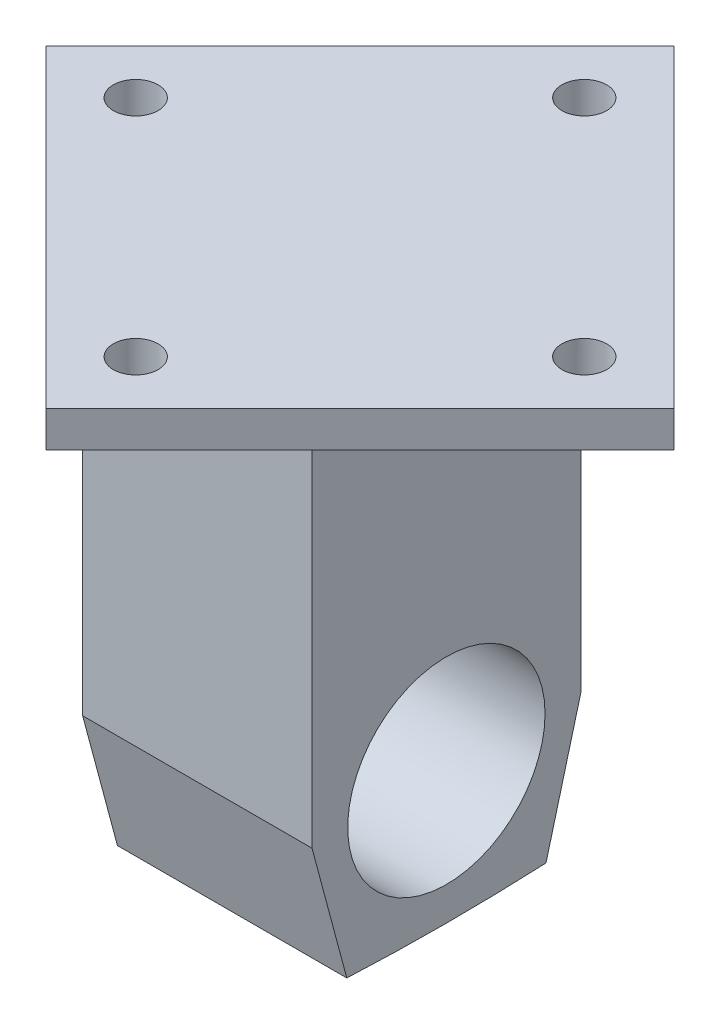
ISO-10303-21;
HEADER;
FILE_DESCRIPTION(('STEP AP214'),'2;1');
FILE_NAME('part.step','',(''),(''),'','','');
FILE_SCHEMA(('AUTOMOTIVE_DESIGN { 1 0 10303 214 1 1 1 1 }'));
ENDSEC;
DATA;
#1=APPLICATION_CONTEXT('core data for automotive mechanical design processes');
#2=APPLICATION_PROTOCOL_DEFINITION('international standard','automotive_design',2000,#1);
#3=PRODUCT_CONTEXT('',#1,'mechanical');
#4=PRODUCT('Part','Part','',(#3));
#5=PRODUCT_RELATED_PRODUCT_CATEGORY('part','',(#4));
#6=PRODUCT_DEFINITION_FORMATION('','',#4);
#7=PRODUCT_DEFINITION_CONTEXT('part definition',#1,'design');
#8=PRODUCT_DEFINITION('design','',#6,#7);
#9=PRODUCT_DEFINITION_SHAPE('','',#8);
#10=(LENGTH_UNIT() NAMED_UNIT(*) SI_UNIT(.MILLI.,.METRE.));
#11=(NAMED_UNIT(*) PLANE_ANGLE_UNIT() SI_UNIT($,.RADIAN.));
#12=(NAMED_UNIT(*) SI_UNIT($,.STERADIAN.) SOLID_ANGLE_UNIT());
#13=UNCERTAINTY_MEASURE_WITH_UNIT(LENGTH_MEASURE(1.E-05),#10,'distance_accuracy_value','');
#14=(GEOMETRIC_REPRESENTATION_CONTEXT(3) GLOBAL_UNCERTAINTY_ASSIGNED_CONTEXT((#13)) GLOBAL_UNIT_ASSIGNED_CONTEXT((#10,
#11,#12)) REPRESENTATION_CONTEXT('',''));
#15=CARTESIAN_POINT('',(0.,0.,0.));
#16=DIRECTION('',(0.,0.,1.));
#17=DIRECTION('',(1.,0.,0.));
#18=AXIS2_PLACEMENT_3D('',#15,#16,#17);
#19=CARTESIAN_POINT('',(16.256,50.292,19.05));
#20=DIRECTION('',(-1.,0.,0.));
#21=DIRECTION('',(0.,0.,1.));
#22=AXIS2_PLACEMENT_3D('',#19,#20,#21);
#23=PLANE('',#22);
#24=CARTESIAN_POINT('',(16.256,0.,0.));
#25=DIRECTION('',(1.,0.,0.));
#26=DIRECTION('',(0.,0.,-1.));
#27=AXIS2_PLACEMENT_3D('',#24,#25,#26);
#28=CIRCLE('',#27,13.9871704);
#29=CARTESIAN_POINT('',(16.256,0.,-13.9871704));
#30=VERTEX_POINT('',#29);
#31=EDGE_CURVE('E133',#30,#30,#28,.T.);
#32=ORIENTED_EDGE('',*,*,#31,.F.);
#33=EDGE_LOOP('',(#32));
#34=FACE_BOUND('',#33,.T.);
#35=DIRECTION('',(0.,-1.,0.));
#36=VECTOR('',#35,1.);
#37=CARTESIAN_POINT('',(16.256,50.292,19.05));
#38=LINE('',#37,#36);
#39=CARTESIAN_POINT('',(16.256,50.292,19.05));
#40=VERTEX_POINT('',#39);
#41=CARTESIAN_POINT('',(16.256,0.,19.05));
#42=VERTEX_POINT('',#41);
#43=EDGE_CURVE('E176',#40,#42,#38,.T.);
#44=ORIENTED_EDGE('',*,*,#43,.T.);
#45=DIRECTION('',(0.,-0.965925826289069,-0.258819045102518));
#46=VECTOR('',#45,1.);
#47=CARTESIAN_POINT('',(16.256,0.,19.05));
#48=LINE('',#47,#46);
#49=CARTESIAN_POINT('',(16.256,-18.4008869908068,14.119497190797));
#50=VERTEX_POINT('',#49);
#51=EDGE_CURVE('E145',#42,#50,#48,.T.);
#52=ORIENTED_EDGE('',*,*,#51,.T.);
#53=CARTESIAN_POINT('',(16.256,281.254621695724,4.34076685363883E-13));
#54=DIRECTION('',(-1.,0.,0.));
#55=DIRECTION('',(0.,0.,1.));
#56=AXIS2_PLACEMENT_3D('',#53,#54,#55);
#57=CIRCLE('',#56,299.987973237435);
#58=CARTESIAN_POINT('',(16.256,-18.4008869908067,-14.119497190797));
#59=VERTEX_POINT('',#58);
#60=EDGE_CURVE('E153',#59,#50,#57,.T.);
#61=ORIENTED_EDGE('',*,*,#60,.F.);
#62=DIRECTION('',(0.,-0.965925826289067,0.258819045102525));
#63=VECTOR('',#62,1.);
#64=CARTESIAN_POINT('',(16.256,0.,-19.05));
#65=LINE('',#64,#63);
#66=CARTESIAN_POINT('',(16.256,0.,-19.05));
#67=VERTEX_POINT('',#66);
#68=EDGE_CURVE('E151',#67,#59,#65,.T.);
#69=ORIENTED_EDGE('',*,*,#68,.F.);
#70=DIRECTION('',(0.,-1.,0.));
#71=VECTOR('',#70,1.);
#72=CARTESIAN_POINT('',(16.256,50.292,-19.05));
#73=LINE('',#72,#71);
#74=CARTESIAN_POINT('',(16.256,50.292,-19.05));
#75=VERTEX_POINT('',#74);
#76=EDGE_CURVE('E11',#75,#67,#73,.T.);
#77=ORIENTED_EDGE('',*,*,#76,.F.);
#78=DIRECTION('',(0.,0.,-1.));
#79=VECTOR('',#78,1.);
#80=CARTESIAN_POINT('',(16.256,50.292,19.05));
#81=LINE('',#80,#79);
#82=EDGE_CURVE('E163',#40,#75,#81,.T.);
#83=ORIENTED_EDGE('',*,*,#82,.F.);
#84=EDGE_LOOP('',(#44,#52,#61,#69,#77,#83));
#85=FACE_BOUND('',#84,.T.);
#86=ADVANCED_FACE('F33',(#34,#85),#23,.F.);
#87=CARTESIAN_POINT('',(-16.256,50.292,-19.05));
#88=DIRECTION('',(0.,0.,1.));
#89=DIRECTION('',(1.,0.,0.));
#90=AXIS2_PLACEMENT_3D('',#87,#88,#89);
#91=PLANE('',#90);
#92=DIRECTION('',(-1.,0.,0.));
#93=VECTOR('',#92,1.);
#94=CARTESIAN_POINT('',(-16.256,0.,-19.05));
#95=LINE('',#94,#93);
#96=CARTESIAN_POINT('',(-16.256,0.,-19.05));
#97=VERTEX_POINT('',#96);
#98=EDGE_CURVE('E162',#67,#97,#95,.T.);
#99=ORIENTED_EDGE('',*,*,#98,.T.);
#100=DIRECTION('',(0.,-1.,0.));
#101=VECTOR('',#100,1.);
#102=CARTESIAN_POINT('',(-16.256,50.292,-19.05));
#103=LINE('',#102,#101);
#104=CARTESIAN_POINT('',(-16.256,50.292,-19.05));
#105=VERTEX_POINT('',#104);
#106=EDGE_CURVE('E42',#105,#97,#103,.T.);
#107=ORIENTED_EDGE('',*,*,#106,.F.);
#108=DIRECTION('',(-1.,0.,0.));
#109=VECTOR('',#108,1.);
#110=CARTESIAN_POINT('',(-16.256,50.292,-19.05));
#111=LINE('',#110,#109);
#112=EDGE_CURVE('E166',#75,#105,#111,.T.);
#113=ORIENTED_EDGE('',*,*,#112,.F.);
#114=ORIENTED_EDGE('',*,*,#76,.T.);
#115=EDGE_LOOP('',(#99,#107,#113,#114));
#116=FACE_BOUND('',#115,.T.);
#117=ADVANCED_FACE('F260',(#116),#91,.F.);
#118=CARTESIAN_POINT('',(-16.256,50.292,19.05));
#119=DIRECTION('',(1.,0.,0.));
#120=DIRECTION('',(0.,0.,-1.));
#121=AXIS2_PLACEMENT_3D('',#118,#119,#120);
#122=PLANE('',#121);
#123=CARTESIAN_POINT('',(-16.256,0.,0.));
#124=DIRECTION('',(1.,0.,0.));
#125=DIRECTION('',(0.,0.,-1.));
#126=AXIS2_PLACEMENT_3D('',#123,#124,#125);
#127=CIRCLE('',#126,13.9871704);
#128=CARTESIAN_POINT('',(-16.256,0.,-13.9871704));
#129=VERTEX_POINT('',#128);
#130=EDGE_CURVE('E136',#129,#129,#127,.T.);
#131=ORIENTED_EDGE('',*,*,#130,.T.);
#132=EDGE_LOOP('',(#131));
#133=FACE_BOUND('',#132,.T.);
#134=ORIENTED_EDGE('',*,*,#106,.T.);
#135=DIRECTION('',(0.,-0.965925826289067,0.258819045102525));
#136=VECTOR('',#135,1.);
#137=CARTESIAN_POINT('',(-16.256,0.,-19.05));
#138=LINE('',#137,#136);
#139=CARTESIAN_POINT('',(-16.256,-18.4008869908067,-14.119497190797));
#140=VERTEX_POINT('',#139);
#141=EDGE_CURVE('E142',#97,#140,#138,.T.);
#142=ORIENTED_EDGE('',*,*,#141,.T.);
#143=CARTESIAN_POINT('',(-16.256,281.254621695724,4.34076685363883E-13));
#144=DIRECTION('',(-1.,0.,0.));
#145=DIRECTION('',(0.,0.,1.));
#146=AXIS2_PLACEMENT_3D('',#143,#144,#145);
#147=CIRCLE('',#146,299.987973237435);
#148=CARTESIAN_POINT('',(-16.256,-18.4008869908068,14.119497190797));
#149=VERTEX_POINT('',#148);
#150=EDGE_CURVE('E144',#140,#149,#147,.T.);
#151=ORIENTED_EDGE('',*,*,#150,.T.);
#152=DIRECTION('',(0.,-0.965925826289069,-0.258819045102518));
#153=VECTOR('',#152,1.);
#154=CARTESIAN_POINT('',(-16.256,0.,19.05));
#155=LINE('',#154,#153);
#156=CARTESIAN_POINT('',(-16.256,0.,19.05));
#157=VERTEX_POINT('',#156);
#158=EDGE_CURVE('E147',#157,#149,#155,.T.);
#159=ORIENTED_EDGE('',*,*,#158,.F.);
#160=DIRECTION('',(0.,-1.,0.));
#161=VECTOR('',#160,1.);
#162=CARTESIAN_POINT('',(-16.256,50.292,19.05));
#163=LINE('',#162,#161);
#164=CARTESIAN_POINT('',(-16.256,50.292,19.05));
#165=VERTEX_POINT('',#164);
#166=EDGE_CURVE('E50',#165,#157,#163,.T.);
#167=ORIENTED_EDGE('',*,*,#166,.F.);
#168=DIRECTION('',(0.,0.,1.));
#169=VECTOR('',#168,1.);
#170=CARTESIAN_POINT('',(-16.256,50.292,19.05));
#171=LINE('',#170,#169);
#172=EDGE_CURVE('E170',#105,#165,#171,.T.);
#173=ORIENTED_EDGE('',*,*,#172,.F.);
#174=EDGE_LOOP('',(#134,#142,#151,#159,#167,#173));
#175=FACE_BOUND('',#174,.T.);
#176=ADVANCED_FACE('F265',(#133,#175),#122,.F.);
#177=CARTESIAN_POINT('',(-16.256,50.292,19.05));
#178=DIRECTION('',(0.,0.,-1.));
#179=DIRECTION('',(-1.,0.,0.));
#180=AXIS2_PLACEMENT_3D('',#177,#178,#179);
#181=PLANE('',#180);
#182=DIRECTION('',(1.,0.,0.));
#183=VECTOR('',#182,1.);
#184=CARTESIAN_POINT('',(-16.256,0.,19.05));
#185=LINE('',#184,#183);
#186=EDGE_CURVE('E167',#157,#42,#185,.T.);
#187=ORIENTED_EDGE('',*,*,#186,.T.);
#188=ORIENTED_EDGE('',*,*,#43,.F.);
#189=DIRECTION('',(1.,0.,0.));
#190=VECTOR('',#189,1.);
#191=CARTESIAN_POINT('',(-16.256,50.292,19.05));
#192=LINE('',#191,#190);
#193=EDGE_CURVE('E173',#165,#40,#192,.T.);
#194=ORIENTED_EDGE('',*,*,#193,.F.);
#195=ORIENTED_EDGE('',*,*,#166,.T.);
#196=EDGE_LOOP('',(#187,#188,#194,#195));
#197=FACE_BOUND('',#196,.T.);
#198=ADVANCED_FACE('F273',(#197),#181,.F.);
#199=CARTESIAN_POINT('',(-16.256,0.,-19.05));
#200=DIRECTION('',(0.,0.258819045102525,0.965925826289067));
#201=DIRECTION('',(0.,-0.965925826289067,0.258819045102525));
#202=AXIS2_PLACEMENT_3D('',#199,#200,#201);
#203=PLANE('',#202);
#204=ORIENTED_EDGE('',*,*,#68,.T.);
#205=DIRECTION('',(1.,0.,0.));
#206=VECTOR('',#205,1.);
#207=CARTESIAN_POINT('',(-16.256,-18.4008869908067,-14.119497190797));
#208=LINE('',#207,#206);
#209=EDGE_CURVE('E159',#140,#59,#208,.T.);
#210=ORIENTED_EDGE('',*,*,#209,.F.);
#211=ORIENTED_EDGE('',*,*,#141,.F.);
#212=ORIENTED_EDGE('',*,*,#98,.F.);
#213=EDGE_LOOP('',(#204,#210,#211,#212));
#214=FACE_BOUND('',#213,.T.);
#215=ADVANCED_FACE('F279',(#214),#203,.F.);
#216=CARTESIAN_POINT('',(-16.256,281.254621695724,4.34076685363883E-13));
#217=DIRECTION('',(1.,0.,0.));
#218=DIRECTION('',(0.,0.,-1.));
#219=AXIS2_PLACEMENT_3D('',#216,#217,#218);
#220=CYLINDRICAL_SURFACE('',#219,299.987973237435);
#221=ORIENTED_EDGE('',*,*,#60,.T.);
#222=DIRECTION('',(1.,0.,0.));
#223=VECTOR('',#222,1.);
#224=CARTESIAN_POINT('',(-16.256,-18.4008869908068,14.119497190797));
#225=LINE('',#224,#223);
#226=EDGE_CURVE('E150',#149,#50,#225,.T.);
#227=ORIENTED_EDGE('',*,*,#226,.F.);
#228=ORIENTED_EDGE('',*,*,#150,.F.);
#229=ORIENTED_EDGE('',*,*,#209,.T.);
#230=EDGE_LOOP('',(#221,#227,#228,#229));
#231=FACE_BOUND('',#230,.T.);
#232=ADVANCED_FACE('F283',(#231),#220,.T.);
#233=CARTESIAN_POINT('',(-16.256,0.,19.05));
#234=DIRECTION('',(0.,-0.258819045102518,0.965925826289069));
#235=DIRECTION('',(0.,-0.965925826289069,-0.258819045102518));
#236=AXIS2_PLACEMENT_3D('',#233,#234,#235);
#237=PLANE('',#236);
#238=ORIENTED_EDGE('',*,*,#51,.F.);
#239=ORIENTED_EDGE('',*,*,#186,.F.);
#240=ORIENTED_EDGE('',*,*,#158,.T.);
#241=ORIENTED_EDGE('',*,*,#226,.T.);
#242=EDGE_LOOP('',(#238,#239,#240,#241));
#243=FACE_BOUND('',#242,.T.);
#244=ADVANCED_FACE('F285',(#243),#237,.T.);
#245=CARTESIAN_POINT('',(-110.744,0.,0.));
#246=DIRECTION('',(1.,0.,0.));
#247=DIRECTION('',(0.,0.,-1.));
#248=AXIS2_PLACEMENT_3D('',#245,#246,#247);
#249=CYLINDRICAL_SURFACE('',#248,13.9871704);
#250=ORIENTED_EDGE('',*,*,#31,.T.);
#251=EDGE_LOOP('',(#250));
#252=FACE_BOUND('',#251,.T.);
#253=ORIENTED_EDGE('',*,*,#130,.F.);
#254=EDGE_LOOP('',(#253));
#255=FACE_BOUND('',#254,.T.);
#256=ADVANCED_FACE('F287',(#252,#255),#249,.F.);
#257=CARTESIAN_POINT('',(43.2862070918434,55.372,-5.21675965261137));
#258=DIRECTION('',(-0.707106781186548,0.,-0.707106781186547));
#259=DIRECTION('',(-0.707106781186547,0.,0.707106781186548));
#260=AXIS2_PLACEMENT_3D('',#257,#258,#259);
#261=PLANE('',#260);
#262=DIRECTION('',(0.707106781186547,0.,-0.707106781186547));
#263=VECTOR('',#262,1.);
#264=CARTESIAN_POINT('',(43.2862070918434,50.292,-5.21675965261137));
#265=LINE('',#264,#263);
#266=CARTESIAN_POINT('',(-1.20793376854951,50.292,39.2773812077816));
#267=VERTEX_POINT('',#266);
#268=CARTESIAN_POINT('',(43.2862070918434,50.292,-5.21675965261137));
#269=VERTEX_POINT('',#268);
#270=EDGE_CURVE('E132',#267,#269,#265,.T.);
#271=ORIENTED_EDGE('',*,*,#270,.T.);
#272=DIRECTION('',(0.,-1.,0.));
#273=VECTOR('',#272,1.);
#274=CARTESIAN_POINT('',(43.2862070918434,55.372,-5.21675965261137));
#275=LINE('',#274,#273);
#276=CARTESIAN_POINT('',(43.2862070918434,55.372,-5.21675965261137));
#277=VERTEX_POINT('',#276);
#278=EDGE_CURVE('E112',#277,#269,#275,.T.);
#279=ORIENTED_EDGE('',*,*,#278,.F.);
#280=DIRECTION('',(0.707106781186547,0.,-0.707106781186547));
#281=VECTOR('',#280,1.);
#282=CARTESIAN_POINT('',(43.2862070918434,55.372,-5.21675965261137));
#283=LINE('',#282,#281);
#284=CARTESIAN_POINT('',(-1.20793376854951,55.372,39.2773812077816));
#285=VERTEX_POINT('',#284);
#286=EDGE_CURVE('E119',#285,#277,#283,.T.);
#287=ORIENTED_EDGE('',*,*,#286,.F.);
#288=DIRECTION('',(0.,-1.,0.));
#289=VECTOR('',#288,1.);
#290=CARTESIAN_POINT('',(-1.20793376854951,55.372,39.2773812077816));
#291=LINE('',#290,#289);
#292=EDGE_CURVE('E210',#285,#267,#291,.T.);
#293=ORIENTED_EDGE('',*,*,#292,.T.);
#294=EDGE_LOOP('',(#271,#279,#287,#293));
#295=FACE_BOUND('',#294,.T.);
#296=ADVANCED_FACE('F130',(#295),#261,.F.);
#297=CARTESIAN_POINT('',(-1.20793376854951,55.372,-49.7109005130043));
#298=DIRECTION('',(-0.707106781186548,0.,0.707106781186547));
#299=DIRECTION('',(0.707106781186547,0.,0.707106781186548));
#300=AXIS2_PLACEMENT_3D('',#297,#298,#299);
#301=PLANE('',#300);
#302=DIRECTION('',(-0.707106781186547,0.,-0.707106781186548));
#303=VECTOR('',#302,1.);
#304=CARTESIAN_POINT('',(-1.20793376854951,50.292,-49.7109005130043));
#305=LINE('',#304,#303);
#306=CARTESIAN_POINT('',(-1.20793376854951,50.292,-49.7109005130043));
#307=VERTEX_POINT('',#306);
#308=EDGE_CURVE('E201',#269,#307,#305,.T.);
#309=ORIENTED_EDGE('',*,*,#308,.T.);
#310=DIRECTION('',(0.,-1.,0.));
#311=VECTOR('',#310,1.);
#312=CARTESIAN_POINT('',(-1.20793376854951,55.372,-49.7109005130043));
#313=LINE('',#312,#311);
#314=CARTESIAN_POINT('',(-1.20793376854951,55.372,-49.7109005130043));
#315=VERTEX_POINT('',#314);
#316=EDGE_CURVE('E115',#315,#307,#313,.T.);
#317=ORIENTED_EDGE('',*,*,#316,.F.);
#318=DIRECTION('',(-0.707106781186547,0.,-0.707106781186548));
#319=VECTOR('',#318,1.);
#320=CARTESIAN_POINT('',(-1.20793376854951,55.372,-49.7109005130043));
#321=LINE('',#320,#319);
#322=EDGE_CURVE('E108',#277,#315,#321,.T.);
#323=ORIENTED_EDGE('',*,*,#322,.F.);
#324=ORIENTED_EDGE('',*,*,#278,.T.);
#325=EDGE_LOOP('',(#309,#317,#323,#324));
#326=FACE_BOUND('',#325,.T.);
#327=ADVANCED_FACE('F110',(#326),#301,.F.);
#328=CARTESIAN_POINT('',(-45.7020746289424,55.372,-5.21675965261137));
#329=DIRECTION('',(0.707106781186548,0.,0.707106781186547));
#330=DIRECTION('',(0.707106781186547,0.,-0.707106781186548));
#331=AXIS2_PLACEMENT_3D('',#328,#329,#330);
#332=PLANE('',#331);
#333=DIRECTION('',(-0.707106781186547,0.,0.707106781186548));
#334=VECTOR('',#333,1.);
#335=CARTESIAN_POINT('',(-45.7020746289424,50.292,-5.21675965261137));
#336=LINE('',#335,#334);
#337=CARTESIAN_POINT('',(-45.7020746289424,50.292,-5.21675965261137));
#338=VERTEX_POINT('',#337);
#339=EDGE_CURVE('E203',#307,#338,#336,.T.);
#340=ORIENTED_EDGE('',*,*,#339,.T.);
#341=DIRECTION('',(0.,-1.,0.));
#342=VECTOR('',#341,1.);
#343=CARTESIAN_POINT('',(-45.7020746289424,55.372,-5.21675965261137));
#344=LINE('',#343,#342);
#345=CARTESIAN_POINT('',(-45.7020746289424,55.372,-5.21675965261137));
#346=VERTEX_POINT('',#345);
#347=EDGE_CURVE('E138',#346,#338,#344,.T.);
#348=ORIENTED_EDGE('',*,*,#347,.F.);
#349=DIRECTION('',(-0.707106781186547,0.,0.707106781186548));
#350=VECTOR('',#349,1.);
#351=CARTESIAN_POINT('',(-45.7020746289424,55.372,-5.21675965261137));
#352=LINE('',#351,#350);
#353=EDGE_CURVE('E118',#315,#346,#352,.T.);
#354=ORIENTED_EDGE('',*,*,#353,.F.);
#355=ORIENTED_EDGE('',*,*,#316,.T.);
#356=EDGE_LOOP('',(#340,#348,#354,#355));
#357=FACE_BOUND('',#356,.T.);
#358=ADVANCED_FACE('F220',(#357),#332,.F.);
#359=CARTESIAN_POINT('',(-1.20793376854951,55.372,39.2773812077816));
#360=DIRECTION('',(0.707106781186548,0.,-0.707106781186547));
#361=DIRECTION('',(-0.707106781186547,0.,-0.707106781186548));
#362=AXIS2_PLACEMENT_3D('',#359,#360,#361);
#363=PLANE('',#362);
#364=DIRECTION('',(0.707106781186547,0.,0.707106781186547));
#365=VECTOR('',#364,1.);
#366=CARTESIAN_POINT('',(-1.20793376854951,50.292,39.2773812077816));
#367=LINE('',#366,#365);
#368=EDGE_CURVE('E128',#338,#267,#367,.T.);
#369=ORIENTED_EDGE('',*,*,#368,.T.);
#370=ORIENTED_EDGE('',*,*,#292,.F.);
#371=DIRECTION('',(0.707106781186547,0.,0.707106781186547));
#372=VECTOR('',#371,1.);
#373=CARTESIAN_POINT('',(-1.20793376854951,55.372,39.2773812077816));
#374=LINE('',#373,#372);
#375=EDGE_CURVE('E124',#346,#285,#374,.T.);
#376=ORIENTED_EDGE('',*,*,#375,.F.);
#377=ORIENTED_EDGE('',*,*,#347,.T.);
#378=EDGE_LOOP('',(#369,#370,#376,#377));
#379=FACE_BOUND('',#378,.T.);
#380=ADVANCED_FACE('F215',(#379),#363,.F.);
#381=CARTESIAN_POINT('',(0.,55.372,0.));
#382=DIRECTION('',(0.,-1.,0.));
#383=DIRECTION('',(0.,0.,-1.));
#384=AXIS2_PLACEMENT_3D('',#381,#382,#383);
#385=PLANE('',#384);
#386=CARTESIAN_POINT('',(30.5862070918434,55.372,-5.21675965261137));
#387=DIRECTION('',(0.,1.,0.));
#388=DIRECTION('',(0.,0.,1.));
#389=AXIS2_PLACEMENT_3D('',#386,#387,#388);
#390=CIRCLE('',#389,3.175);
#391=CARTESIAN_POINT('',(30.5862070918434,55.372,-2.04175965261137));
#392=VERTEX_POINT('',#391);
#393=EDGE_CURVE('E192',#392,#392,#390,.T.);
#394=ORIENTED_EDGE('',*,*,#393,.F.);
#395=EDGE_LOOP('',(#394));
#396=FACE_BOUND('',#395,.T.);
#397=CARTESIAN_POINT('',(-1.20793376854951,55.372,26.5773812077816));
#398=DIRECTION('',(0.,1.,0.));
#399=DIRECTION('',(0.,0.,1.));
#400=AXIS2_PLACEMENT_3D('',#397,#398,#399);
#401=CIRCLE('',#400,3.175);
#402=CARTESIAN_POINT('',(-1.20793376854951,55.372,29.7523812077816));
#403=VERTEX_POINT('',#402);
#404=EDGE_CURVE('E228',#403,#403,#401,.T.);
#405=ORIENTED_EDGE('',*,*,#404,.F.);
#406=EDGE_LOOP('',(#405));
#407=FACE_BOUND('',#406,.T.);
#408=CARTESIAN_POINT('',(-1.20793376854951,55.372,-37.0109005130043));
#409=DIRECTION('',(0.,1.,0.));
#410=DIRECTION('',(0.,0.,-1.));
#411=AXIS2_PLACEMENT_3D('',#408,#409,#410);
#412=CIRCLE('',#411,3.175);
#413=CARTESIAN_POINT('',(-1.20793376854951,55.372,-40.1859005130043));
#414=VERTEX_POINT('',#413);
#415=EDGE_CURVE('E225',#414,#414,#412,.T.);
#416=ORIENTED_EDGE('',*,*,#415,.F.);
#417=EDGE_LOOP('',(#416));
#418=FACE_BOUND('',#417,.T.);
#419=CARTESIAN_POINT('',(-33.0020746289424,55.372,-5.21675965261137));
#420=DIRECTION('',(0.,1.,0.));
#421=DIRECTION('',(0.,0.,-1.));
#422=AXIS2_PLACEMENT_3D('',#419,#420,#421);
#423=CIRCLE('',#422,3.175);
#424=CARTESIAN_POINT('',(-33.0020746289424,55.372,-8.39175965261137));
#425=VERTEX_POINT('',#424);
#426=EDGE_CURVE('E222',#425,#425,#423,.T.);
#427=ORIENTED_EDGE('',*,*,#426,.F.);
#428=EDGE_LOOP('',(#427));
#429=FACE_BOUND('',#428,.T.);
#430=ORIENTED_EDGE('',*,*,#286,.T.);
#431=ORIENTED_EDGE('',*,*,#322,.T.);
#432=ORIENTED_EDGE('',*,*,#353,.T.);
#433=ORIENTED_EDGE('',*,*,#375,.T.);
#434=EDGE_LOOP('',(#430,#431,#432,#433));
#435=FACE_BOUND('',#434,.T.);
#436=ADVANCED_FACE('F122',(#396,#407,#418,#429,#435),#385,.F.);
#437=CARTESIAN_POINT('',(0.,50.292,0.));
#438=DIRECTION('',(0.,-1.,0.));
#439=DIRECTION('',(0.,0.,-1.));
#440=AXIS2_PLACEMENT_3D('',#437,#438,#439);
#441=PLANE('',#440);
#442=CARTESIAN_POINT('',(30.5862070918434,50.292,-5.21675965261137));
#443=DIRECTION('',(0.,-1.,0.));
#444=DIRECTION('',(0.,0.,-1.));
#445=AXIS2_PLACEMENT_3D('',#442,#443,#444);
#446=CIRCLE('',#445,3.175);
#447=CARTESIAN_POINT('',(30.5862070918434,50.292,-8.39175965261137));
#448=VERTEX_POINT('',#447);
#449=EDGE_CURVE('E36',#448,#448,#446,.T.);
#450=ORIENTED_EDGE('',*,*,#449,.F.);
#451=EDGE_LOOP('',(#450));
#452=FACE_BOUND('',#451,.T.);
#453=CARTESIAN_POINT('',(-1.20793376854951,50.292,26.5773812077816));
#454=DIRECTION('',(0.,-1.,0.));
#455=DIRECTION('',(0.,0.,-1.));
#456=AXIS2_PLACEMENT_3D('',#453,#454,#455);
#457=CIRCLE('',#456,3.175);
#458=CARTESIAN_POINT('',(-1.20793376854951,50.292,23.4023812077816));
#459=VERTEX_POINT('',#458);
#460=EDGE_CURVE('E194',#459,#459,#457,.T.);
#461=ORIENTED_EDGE('',*,*,#460,.F.);
#462=EDGE_LOOP('',(#461));
#463=FACE_BOUND('',#462,.T.);
#464=CARTESIAN_POINT('',(-1.20793376854951,50.292,-37.0109005130043));
#465=DIRECTION('',(0.,-1.,0.));
#466=DIRECTION('',(0.,0.,-1.));
#467=AXIS2_PLACEMENT_3D('',#464,#465,#466);
#468=CIRCLE('',#467,3.175);
#469=CARTESIAN_POINT('',(-1.20793376854951,50.292,-40.1859005130043));
#470=VERTEX_POINT('',#469);
#471=EDGE_CURVE('E191',#470,#470,#468,.T.);
#472=ORIENTED_EDGE('',*,*,#471,.F.);
#473=EDGE_LOOP('',(#472));
#474=FACE_BOUND('',#473,.T.);
#475=CARTESIAN_POINT('',(-33.0020746289424,50.292,-5.21675965261137));
#476=DIRECTION('',(0.,-1.,0.));
#477=DIRECTION('',(0.,0.,-1.));
#478=AXIS2_PLACEMENT_3D('',#475,#476,#477);
#479=CIRCLE('',#478,3.175);
#480=CARTESIAN_POINT('',(-33.0020746289424,50.292,-8.39175965261137));
#481=VERTEX_POINT('',#480);
#482=EDGE_CURVE('E188',#481,#481,#479,.T.);
#483=ORIENTED_EDGE('',*,*,#482,.F.);
#484=EDGE_LOOP('',(#483));
#485=FACE_BOUND('',#484,.T.);
#486=ORIENTED_EDGE('',*,*,#193,.T.);
#487=ORIENTED_EDGE('',*,*,#82,.T.);
#488=ORIENTED_EDGE('',*,*,#112,.T.);
#489=ORIENTED_EDGE('',*,*,#172,.T.);
#490=EDGE_LOOP('',(#486,#487,#488,#489));
#491=FACE_BOUND('',#490,.T.);
#492=ORIENTED_EDGE('',*,*,#270,.F.);
#493=ORIENTED_EDGE('',*,*,#368,.F.);
#494=ORIENTED_EDGE('',*,*,#339,.F.);
#495=ORIENTED_EDGE('',*,*,#308,.F.);
#496=EDGE_LOOP('',(#492,#493,#494,#495));
#497=FACE_BOUND('',#496,.T.);
#498=ADVANCED_FACE('F219',(#452,#463,#474,#485,#491,#497),#441,.T.);
#499=CARTESIAN_POINT('',(-33.0020746289424,-18.7333515417117,-5.21675965261137));
#500=DIRECTION('',(0.,1.,0.));
#501=DIRECTION('',(0.,0.,1.));
#502=AXIS2_PLACEMENT_3D('',#499,#500,#501);
#503=CYLINDRICAL_SURFACE('',#502,3.175);
#504=ORIENTED_EDGE('',*,*,#482,.T.);
#505=EDGE_LOOP('',(#504));
#506=FACE_BOUND('',#505,.T.);
#507=ORIENTED_EDGE('',*,*,#426,.T.);
#508=EDGE_LOOP('',(#507));
#509=FACE_BOUND('',#508,.T.);
#510=ADVANCED_FACE('F245',(#506,#509),#503,.F.);
#511=CARTESIAN_POINT('',(-1.20793376854951,-18.7333515417117,-37.0109005130043));
#512=DIRECTION('',(0.,1.,0.));
#513=DIRECTION('',(0.,0.,1.));
#514=AXIS2_PLACEMENT_3D('',#511,#512,#513);
#515=CYLINDRICAL_SURFACE('',#514,3.175);
#516=ORIENTED_EDGE('',*,*,#471,.T.);
#517=EDGE_LOOP('',(#516));
#518=FACE_BOUND('',#517,.T.);
#519=ORIENTED_EDGE('',*,*,#415,.T.);
#520=EDGE_LOOP('',(#519));
#521=FACE_BOUND('',#520,.T.);
#522=ADVANCED_FACE('F247',(#518,#521),#515,.F.);
#523=CARTESIAN_POINT('',(-1.20793376854951,-18.7333515417117,26.5773812077816));
#524=DIRECTION('',(0.,1.,0.));
#525=DIRECTION('',(0.,0.,1.));
#526=AXIS2_PLACEMENT_3D('',#523,#524,#525);
#527=CYLINDRICAL_SURFACE('',#526,3.175);
#528=ORIENTED_EDGE('',*,*,#460,.T.);
#529=EDGE_LOOP('',(#528));
#530=FACE_BOUND('',#529,.T.);
#531=ORIENTED_EDGE('',*,*,#404,.T.);
#532=EDGE_LOOP('',(#531));
#533=FACE_BOUND('',#532,.T.);
#534=ADVANCED_FACE('F254',(#530,#533),#527,.F.);
#535=CARTESIAN_POINT('',(30.5862070918434,-18.7333515417117,-5.21675965261137));
#536=DIRECTION('',(0.,1.,0.));
#537=DIRECTION('',(0.,0.,1.));
#538=AXIS2_PLACEMENT_3D('',#535,#536,#537);
#539=CYLINDRICAL_SURFACE('',#538,3.175);
#540=ORIENTED_EDGE('',*,*,#449,.T.);
#541=EDGE_LOOP('',(#540));
#542=FACE_BOUND('',#541,.T.);
#543=ORIENTED_EDGE('',*,*,#393,.T.);
#544=EDGE_LOOP('',(#543));
#545=FACE_BOUND('',#544,.T.);
#546=ADVANCED_FACE('F234',(#542,#545),#539,.F.);
#547=CLOSED_SHELL('',(#86,#117,#176,#198,#215,#232,#244,#256,#296,#327,#358,#380,#436,#498,#510,
#522,#534,#546));
#548=MANIFOLD_SOLID_BREP('B2',#547);
#549=ADVANCED_BREP_SHAPE_REPRESENTATION('',(#18,#548),#14);
#550=SHAPE_DEFINITION_REPRESENTATION(#9,#549);
ENDSEC;
END-ISO-10303-21;
